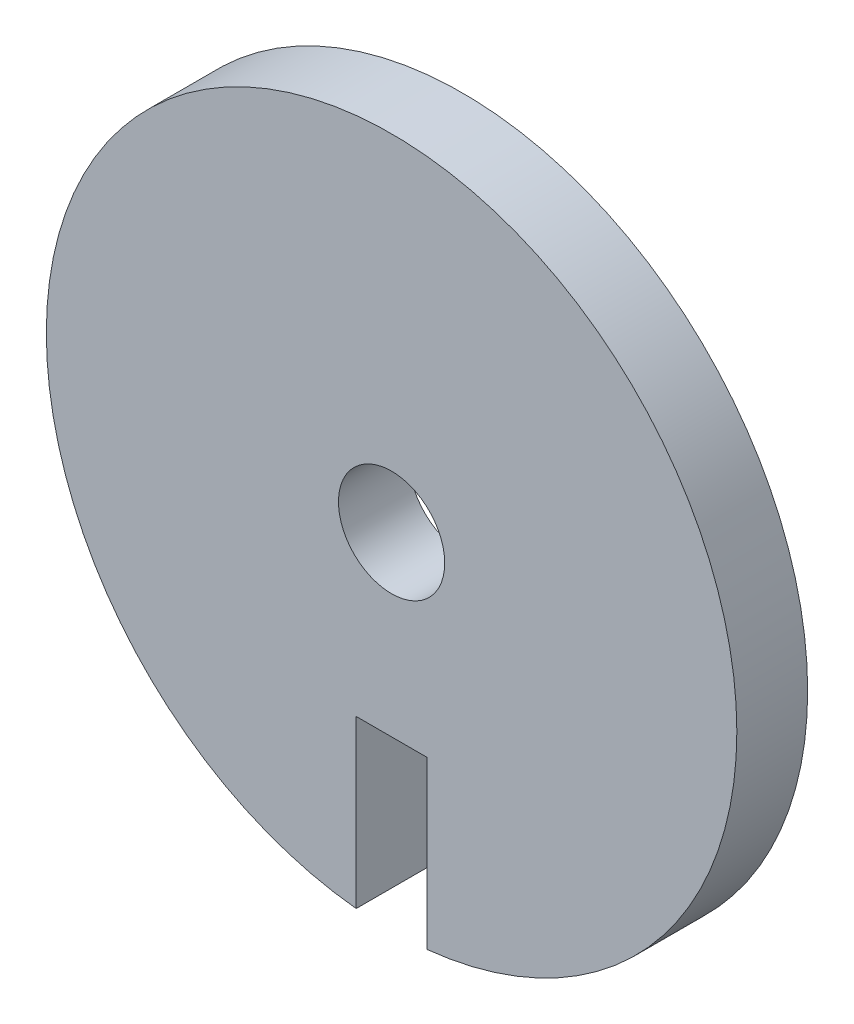
ISO-10303-21;
HEADER;
FILE_DESCRIPTION(('STEP AP214'),'2;1');
FILE_NAME('part.step','',(''),(''),'','','');
FILE_SCHEMA(('AUTOMOTIVE_DESIGN { 1 0 10303 214 1 1 1 1 }'));
ENDSEC;
DATA;
#1=APPLICATION_CONTEXT('core data for automotive mechanical design processes');
#2=APPLICATION_PROTOCOL_DEFINITION('international standard','automotive_design',2000,#1);
#3=PRODUCT_CONTEXT('',#1,'mechanical');
#4=PRODUCT('Part','Part','',(#3));
#5=PRODUCT_RELATED_PRODUCT_CATEGORY('part','',(#4));
#6=PRODUCT_DEFINITION_FORMATION('','',#4);
#7=PRODUCT_DEFINITION_CONTEXT('part definition',#1,'design');
#8=PRODUCT_DEFINITION('design','',#6,#7);
#9=PRODUCT_DEFINITION_SHAPE('','',#8);
#10=(LENGTH_UNIT() NAMED_UNIT(*) SI_UNIT(.MILLI.,.METRE.));
#11=(NAMED_UNIT(*) PLANE_ANGLE_UNIT() SI_UNIT($,.RADIAN.));
#12=(NAMED_UNIT(*) SI_UNIT($,.STERADIAN.) SOLID_ANGLE_UNIT());
#13=UNCERTAINTY_MEASURE_WITH_UNIT(LENGTH_MEASURE(1.E-05),#10,'distance_accuracy_value','');
#14=(GEOMETRIC_REPRESENTATION_CONTEXT(3) GLOBAL_UNCERTAINTY_ASSIGNED_CONTEXT((#13)) GLOBAL_UNIT_ASSIGNED_CONTEXT((#10,
#11,#12)) REPRESENTATION_CONTEXT('',''));
#15=CARTESIAN_POINT('',(0.,0.,0.));
#16=DIRECTION('',(0.,0.,1.));
#17=DIRECTION('',(1.,0.,0.));
#18=AXIS2_PLACEMENT_3D('',#15,#16,#17);
#19=CARTESIAN_POINT('',(0.,0.,4.));
#20=DIRECTION('',(0.,0.,-1.));
#21=DIRECTION('',(-1.,0.,0.));
#22=AXIS2_PLACEMENT_3D('',#19,#20,#21);
#23=CYLINDRICAL_SURFACE('',#22,19.5);
#24=CARTESIAN_POINT('',(0.,0.,0.));
#25=DIRECTION('',(0.,0.,1.));
#26=DIRECTION('',(1.,0.,0.));
#27=AXIS2_PLACEMENT_3D('',#24,#25,#26);
#28=CIRCLE('',#27,19.5);
#29=CARTESIAN_POINT('',(2.,-19.3971647412708,0.));
#30=VERTEX_POINT('',#29);
#31=CARTESIAN_POINT('',(-2.,-19.3971647412708,0.));
#32=VERTEX_POINT('',#31);
#33=EDGE_CURVE('E103',#30,#32,#28,.T.);
#34=ORIENTED_EDGE('',*,*,#33,.T.);
#35=DIRECTION('',(0.,0.,-1.));
#36=VECTOR('',#35,1.);
#37=CARTESIAN_POINT('',(-2.,-19.3971647412708,4.));
#38=LINE('',#37,#36);
#39=CARTESIAN_POINT('',(-2.,-19.3971647412708,4.));
#40=VERTEX_POINT('',#39);
#41=EDGE_CURVE('E55',#32,#40,#38,.F.);
#42=ORIENTED_EDGE('',*,*,#41,.T.);
#43=CARTESIAN_POINT('',(0.,0.,4.));
#44=DIRECTION('',(0.,0.,1.));
#45=DIRECTION('',(1.,0.,0.));
#46=AXIS2_PLACEMENT_3D('',#43,#44,#45);
#47=CIRCLE('',#46,19.5);
#48=CARTESIAN_POINT('',(2.,-19.3971647412708,4.));
#49=VERTEX_POINT('',#48);
#50=EDGE_CURVE('E40',#49,#40,#47,.T.);
#51=ORIENTED_EDGE('',*,*,#50,.F.);
#52=DIRECTION('',(0.,0.,-1.));
#53=VECTOR('',#52,1.);
#54=CARTESIAN_POINT('',(2.,-19.3971647412708,4.));
#55=LINE('',#54,#53);
#56=EDGE_CURVE('E78',#49,#30,#55,.T.);
#57=ORIENTED_EDGE('',*,*,#56,.T.);
#58=EDGE_LOOP('',(#34,#42,#51,#57));
#59=FACE_BOUND('',#58,.T.);
#60=ADVANCED_FACE('F33',(#59),#23,.T.);
#61=CARTESIAN_POINT('',(0.,0.,4.));
#62=DIRECTION('',(0.,0.,1.));
#63=DIRECTION('',(1.,0.,0.));
#64=AXIS2_PLACEMENT_3D('',#61,#62,#63);
#65=PLANE('',#64);
#66=DIRECTION('',(0.,-1.,0.));
#67=VECTOR('',#66,1.);
#68=CARTESIAN_POINT('',(-2.,-20.,4.));
#69=LINE('',#68,#67);
#70=CARTESIAN_POINT('',(-2.,-10.,4.));
#71=VERTEX_POINT('',#70);
#72=EDGE_CURVE('E91',#71,#40,#69,.T.);
#73=ORIENTED_EDGE('',*,*,#72,.F.);
#74=DIRECTION('',(-1.,0.,0.));
#75=VECTOR('',#74,1.);
#76=CARTESIAN_POINT('',(-2.,-10.,4.));
#77=LINE('',#76,#75);
#78=CARTESIAN_POINT('',(2.,-10.,4.));
#79=VERTEX_POINT('',#78);
#80=EDGE_CURVE('E76',#79,#71,#77,.T.);
#81=ORIENTED_EDGE('',*,*,#80,.F.);
#82=DIRECTION('',(0.,1.,0.));
#83=VECTOR('',#82,1.);
#84=CARTESIAN_POINT('',(2.,-20.,4.));
#85=LINE('',#84,#83);
#86=EDGE_CURVE('E93',#49,#79,#85,.T.);
#87=ORIENTED_EDGE('',*,*,#86,.F.);
#88=ORIENTED_EDGE('',*,*,#50,.T.);
#89=EDGE_LOOP('',(#73,#81,#87,#88));
#90=FACE_BOUND('',#89,.T.);
#91=CARTESIAN_POINT('',(0.,0.,4.));
#92=DIRECTION('',(0.,0.,1.));
#93=DIRECTION('',(1.,0.,0.));
#94=AXIS2_PLACEMENT_3D('',#91,#92,#93);
#95=CIRCLE('',#94,3.);
#96=CARTESIAN_POINT('',(3.,0.,4.));
#97=VERTEX_POINT('',#96);
#98=EDGE_CURVE('E99',#97,#97,#95,.T.);
#99=ORIENTED_EDGE('',*,*,#98,.F.);
#100=EDGE_LOOP('',(#99));
#101=FACE_BOUND('',#100,.T.);
#102=ADVANCED_FACE('F113',(#90,#101),#65,.T.);
#103=CARTESIAN_POINT('',(0.,0.,0.));
#104=DIRECTION('',(0.,0.,1.));
#105=DIRECTION('',(1.,0.,0.));
#106=AXIS2_PLACEMENT_3D('',#103,#104,#105);
#107=PLANE('',#106);
#108=CARTESIAN_POINT('',(0.,0.,0.));
#109=DIRECTION('',(0.,0.,1.));
#110=DIRECTION('',(1.,0.,0.));
#111=AXIS2_PLACEMENT_3D('',#108,#109,#110);
#112=CIRCLE('',#111,3.);
#113=CARTESIAN_POINT('',(3.,0.,0.));
#114=VERTEX_POINT('',#113);
#115=EDGE_CURVE('E100',#114,#114,#112,.T.);
#116=ORIENTED_EDGE('',*,*,#115,.T.);
#117=EDGE_LOOP('',(#116));
#118=FACE_BOUND('',#117,.T.);
#119=DIRECTION('',(-1.,0.,0.));
#120=VECTOR('',#119,1.);
#121=CARTESIAN_POINT('',(-2.,-10.,0.));
#122=LINE('',#121,#120);
#123=CARTESIAN_POINT('',(2.,-10.,0.));
#124=VERTEX_POINT('',#123);
#125=CARTESIAN_POINT('',(-2.,-10.,0.));
#126=VERTEX_POINT('',#125);
#127=EDGE_CURVE('E47',#124,#126,#122,.T.);
#128=ORIENTED_EDGE('',*,*,#127,.T.);
#129=DIRECTION('',(0.,-1.,0.));
#130=VECTOR('',#129,1.);
#131=CARTESIAN_POINT('',(-2.,-20.,0.));
#132=LINE('',#131,#130);
#133=EDGE_CURVE('E81',#126,#32,#132,.T.);
#134=ORIENTED_EDGE('',*,*,#133,.T.);
#135=ORIENTED_EDGE('',*,*,#33,.F.);
#136=DIRECTION('',(0.,1.,0.));
#137=VECTOR('',#136,1.);
#138=CARTESIAN_POINT('',(2.,0.,0.));
#139=LINE('',#138,#137);
#140=EDGE_CURVE('E11',#30,#124,#139,.T.);
#141=ORIENTED_EDGE('',*,*,#140,.T.);
#142=EDGE_LOOP('',(#128,#134,#135,#141));
#143=FACE_BOUND('',#142,.T.);
#144=ADVANCED_FACE('F87',(#118,#143),#107,.F.);
#145=CARTESIAN_POINT('',(0.,0.,0.));
#146=DIRECTION('',(0.,0.,1.));
#147=DIRECTION('',(1.,0.,0.));
#148=AXIS2_PLACEMENT_3D('',#145,#146,#147);
#149=CYLINDRICAL_SURFACE('',#148,3.);
#150=ORIENTED_EDGE('',*,*,#115,.F.);
#151=EDGE_LOOP('',(#150));
#152=FACE_BOUND('',#151,.T.);
#153=ORIENTED_EDGE('',*,*,#98,.T.);
#154=EDGE_LOOP('',(#153));
#155=FACE_BOUND('',#154,.T.);
#156=ADVANCED_FACE('F119',(#152,#155),#149,.F.);
#157=CARTESIAN_POINT('',(-2.,-20.,0.));
#158=DIRECTION('',(-1.,0.,0.));
#159=DIRECTION('',(0.,0.,1.));
#160=AXIS2_PLACEMENT_3D('',#157,#158,#159);
#161=PLANE('',#160);
#162=ORIENTED_EDGE('',*,*,#133,.F.);
#163=DIRECTION('',(0.,0.,1.));
#164=VECTOR('',#163,1.);
#165=CARTESIAN_POINT('',(-2.,-10.,0.));
#166=LINE('',#165,#164);
#167=EDGE_CURVE('E73',#126,#71,#166,.T.);
#168=ORIENTED_EDGE('',*,*,#167,.T.);
#169=ORIENTED_EDGE('',*,*,#72,.T.);
#170=ORIENTED_EDGE('',*,*,#41,.F.);
#171=EDGE_LOOP('',(#162,#168,#169,#170));
#172=FACE_BOUND('',#171,.T.);
#173=ADVANCED_FACE('F82',(#172),#161,.F.);
#174=CARTESIAN_POINT('',(2.,-20.,0.));
#175=DIRECTION('',(1.,0.,0.));
#176=DIRECTION('',(0.,0.,-1.));
#177=AXIS2_PLACEMENT_3D('',#174,#175,#176);
#178=PLANE('',#177);
#179=ORIENTED_EDGE('',*,*,#86,.T.);
#180=DIRECTION('',(0.,0.,1.));
#181=VECTOR('',#180,1.);
#182=CARTESIAN_POINT('',(2.,-10.,0.));
#183=LINE('',#182,#181);
#184=EDGE_CURVE('E79',#124,#79,#183,.T.);
#185=ORIENTED_EDGE('',*,*,#184,.F.);
#186=ORIENTED_EDGE('',*,*,#140,.F.);
#187=ORIENTED_EDGE('',*,*,#56,.F.);
#188=EDGE_LOOP('',(#179,#185,#186,#187));
#189=FACE_BOUND('',#188,.T.);
#190=ADVANCED_FACE('F111',(#189),#178,.F.);
#191=CARTESIAN_POINT('',(-2.,-10.,0.));
#192=DIRECTION('',(0.,1.,0.));
#193=DIRECTION('',(-1.,0.,0.));
#194=AXIS2_PLACEMENT_3D('',#191,#192,#193);
#195=PLANE('',#194);
#196=ORIENTED_EDGE('',*,*,#80,.T.);
#197=ORIENTED_EDGE('',*,*,#167,.F.);
#198=ORIENTED_EDGE('',*,*,#127,.F.);
#199=ORIENTED_EDGE('',*,*,#184,.T.);
#200=EDGE_LOOP('',(#196,#197,#198,#199));
#201=FACE_BOUND('',#200,.T.);
#202=ADVANCED_FACE('F74',(#201),#195,.F.);
#203=CLOSED_SHELL('',(#60,#102,#144,#156,#173,#190,#202));
#204=MANIFOLD_SOLID_BREP('B2',#203);
#205=ADVANCED_BREP_SHAPE_REPRESENTATION('',(#18,#204),#14);
#206=SHAPE_DEFINITION_REPRESENTATION(#9,#205);
ENDSEC;
END-ISO-10303-21;
